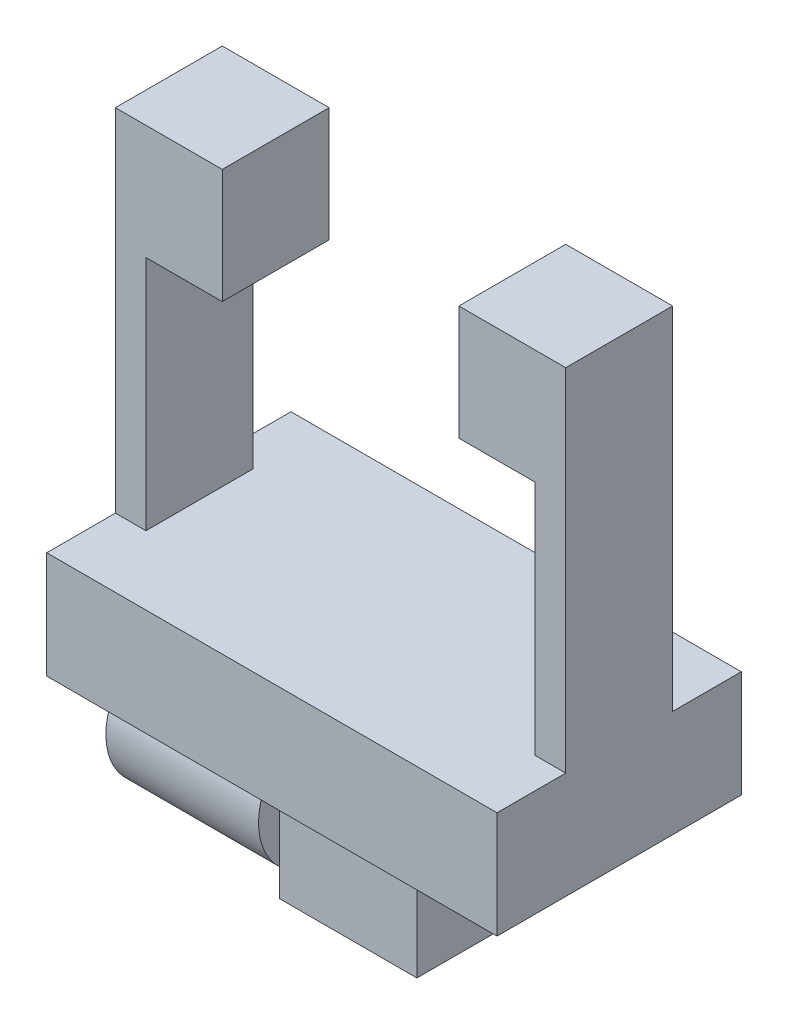
ISO-10303-21;
HEADER;
FILE_DESCRIPTION(('STEP AP214'),'2;1');
FILE_NAME('part.step','',(''),(''),'','','');
FILE_SCHEMA(('AUTOMOTIVE_DESIGN { 1 0 10303 214 1 1 1 1 }'));
ENDSEC;
DATA;
#1=APPLICATION_CONTEXT('core data for automotive mechanical design processes');
#2=APPLICATION_PROTOCOL_DEFINITION('international standard','automotive_design',2000,#1);
#3=PRODUCT_CONTEXT('',#1,'mechanical');
#4=PRODUCT('Part','Part','',(#3));
#5=PRODUCT_RELATED_PRODUCT_CATEGORY('part','',(#4));
#6=PRODUCT_DEFINITION_FORMATION('','',#4);
#7=PRODUCT_DEFINITION_CONTEXT('part definition',#1,'design');
#8=PRODUCT_DEFINITION('design','',#6,#7);
#9=PRODUCT_DEFINITION_SHAPE('','',#8);
#10=(LENGTH_UNIT() NAMED_UNIT(*) SI_UNIT(.MILLI.,.METRE.));
#11=(NAMED_UNIT(*) PLANE_ANGLE_UNIT() SI_UNIT($,.RADIAN.));
#12=(NAMED_UNIT(*) SI_UNIT($,.STERADIAN.) SOLID_ANGLE_UNIT());
#13=UNCERTAINTY_MEASURE_WITH_UNIT(LENGTH_MEASURE(1.E-05),#10,'distance_accuracy_value','');
#14=(GEOMETRIC_REPRESENTATION_CONTEXT(3) GLOBAL_UNCERTAINTY_ASSIGNED_CONTEXT((#13)) GLOBAL_UNIT_ASSIGNED_CONTEXT((#10,
#11,#12)) REPRESENTATION_CONTEXT('',''));
#15=CARTESIAN_POINT('',(0.,0.,0.));
#16=DIRECTION('',(0.,0.,1.));
#17=DIRECTION('',(1.,0.,0.));
#18=AXIS2_PLACEMENT_3D('',#15,#16,#17);
#19=CARTESIAN_POINT('',(-11.43,-8.89,7.62));
#20=DIRECTION('',(1.,0.,0.));
#21=DIRECTION('',(0.,1.,0.));
#22=AXIS2_PLACEMENT_3D('',#19,#20,#21);
#23=PLANE('',#22);
#24=CARTESIAN_POINT('',(-11.43,-21.59,0.));
#25=DIRECTION('',(-1.,0.,0.));
#26=DIRECTION('',(0.,-1.,0.));
#27=AXIS2_PLACEMENT_3D('',#24,#25,#26);
#28=CIRCLE('',#27,11.1125);
#29=CARTESIAN_POINT('',(-11.43,-13.5015356061858,7.62));
#30=VERTEX_POINT('',#29);
#31=CARTESIAN_POINT('',(-11.43,-13.5015356061858,-7.62));
#32=VERTEX_POINT('',#31);
#33=EDGE_CURVE('E66',#30,#32,#28,.T.);
#34=ORIENTED_EDGE('',*,*,#33,.F.);
#35=DIRECTION('',(0.,-1.,0.));
#36=VECTOR('',#35,1.);
#37=CARTESIAN_POINT('',(-11.43,-8.89,7.62));
#38=LINE('',#37,#36);
#39=CARTESIAN_POINT('',(-11.43,-8.89,7.62));
#40=VERTEX_POINT('',#39);
#41=EDGE_CURVE('E207',#40,#30,#38,.T.);
#42=ORIENTED_EDGE('',*,*,#41,.F.);
#43=DIRECTION('',(0.,0.,-1.));
#44=VECTOR('',#43,1.);
#45=CARTESIAN_POINT('',(-11.43,-8.89,7.62));
#46=LINE('',#45,#44);
#47=CARTESIAN_POINT('',(-11.43,-8.89,-7.62));
#48=VERTEX_POINT('',#47);
#49=EDGE_CURVE('E244',#40,#48,#46,.T.);
#50=ORIENTED_EDGE('',*,*,#49,.T.);
#51=DIRECTION('',(0.,-1.,0.));
#52=VECTOR('',#51,1.);
#53=CARTESIAN_POINT('',(-11.43,-8.89,-7.62));
#54=LINE('',#53,#52);
#55=EDGE_CURVE('E246',#48,#32,#54,.T.);
#56=ORIENTED_EDGE('',*,*,#55,.T.);
#57=EDGE_LOOP('',(#34,#42,#50,#56));
#58=FACE_BOUND('',#57,.T.);
#59=ADVANCED_FACE('F47',(#58),#23,.F.);
#60=CARTESIAN_POINT('',(37.465,-8.89,20.32));
#61=DIRECTION('',(-1.,0.,0.));
#62=DIRECTION('',(0.,0.,1.));
#63=AXIS2_PLACEMENT_3D('',#60,#61,#62);
#64=PLANE('',#63);
#65=DIRECTION('',(0.,1.,0.));
#66=VECTOR('',#65,1.);
#67=CARTESIAN_POINT('',(37.465,-8.89,-20.32));
#68=LINE('',#67,#66);
#69=CARTESIAN_POINT('',(37.465,-8.89,-20.32));
#70=VERTEX_POINT('',#69);
#71=CARTESIAN_POINT('',(37.465,8.89,-20.32));
#72=VERTEX_POINT('',#71);
#73=EDGE_CURVE('E296',#70,#72,#68,.T.);
#74=ORIENTED_EDGE('',*,*,#73,.T.);
#75=DIRECTION('',(0.,0.,-1.));
#76=VECTOR('',#75,1.);
#77=CARTESIAN_POINT('',(37.465,8.89,20.32));
#78=LINE('',#77,#76);
#79=CARTESIAN_POINT('',(37.465,8.89,-8.89));
#80=VERTEX_POINT('',#79);
#81=EDGE_CURVE('E56',#80,#72,#78,.T.);
#82=ORIENTED_EDGE('',*,*,#81,.F.);
#83=DIRECTION('',(0.,1.,0.));
#84=VECTOR('',#83,1.);
#85=CARTESIAN_POINT('',(37.465,8.89,-8.89));
#86=LINE('',#85,#84);
#87=CARTESIAN_POINT('',(37.465,67.31,-8.89));
#88=VERTEX_POINT('',#87);
#89=EDGE_CURVE('E372',#80,#88,#86,.T.);
#90=ORIENTED_EDGE('',*,*,#89,.T.);
#91=DIRECTION('',(0.,0.,-1.));
#92=VECTOR('',#91,1.);
#93=CARTESIAN_POINT('',(37.465,67.31,8.89));
#94=LINE('',#93,#92);
#95=CARTESIAN_POINT('',(37.465,67.31,8.89));
#96=VERTEX_POINT('',#95);
#97=EDGE_CURVE('E389',#96,#88,#94,.T.);
#98=ORIENTED_EDGE('',*,*,#97,.F.);
#99=DIRECTION('',(0.,1.,0.));
#100=VECTOR('',#99,1.);
#101=CARTESIAN_POINT('',(37.465,8.89,8.89));
#102=LINE('',#101,#100);
#103=CARTESIAN_POINT('',(37.465,8.89,8.89));
#104=VERTEX_POINT('',#103);
#105=EDGE_CURVE('E290',#104,#96,#102,.T.);
#106=ORIENTED_EDGE('',*,*,#105,.F.);
#107=CARTESIAN_POINT('',(37.465,8.89,20.32));
#108=VERTEX_POINT('',#107);
#109=EDGE_CURVE('E12',#108,#104,#78,.T.);
#110=ORIENTED_EDGE('',*,*,#109,.F.);
#111=DIRECTION('',(0.,1.,0.));
#112=VECTOR('',#111,1.);
#113=CARTESIAN_POINT('',(37.465,-8.89,20.32));
#114=LINE('',#113,#112);
#115=CARTESIAN_POINT('',(37.465,-8.89,20.32));
#116=VERTEX_POINT('',#115);
#117=EDGE_CURVE('E279',#116,#108,#114,.T.);
#118=ORIENTED_EDGE('',*,*,#117,.F.);
#119=DIRECTION('',(0.,0.,-1.));
#120=VECTOR('',#119,1.);
#121=CARTESIAN_POINT('',(37.465,-8.89,20.32));
#122=LINE('',#121,#120);
#123=EDGE_CURVE('E300',#116,#70,#122,.T.);
#124=ORIENTED_EDGE('',*,*,#123,.T.);
#125=EDGE_LOOP('',(#74,#82,#90,#98,#106,#110,#118,#124));
#126=FACE_BOUND('',#125,.T.);
#127=ADVANCED_FACE('F51',(#126),#64,.F.);
#128=CARTESIAN_POINT('',(-37.465,8.89,20.32));
#129=DIRECTION('',(0.,-1.,0.));
#130=DIRECTION('',(0.,0.,-1.));
#131=AXIS2_PLACEMENT_3D('',#128,#129,#130);
#132=PLANE('',#131);
#133=DIRECTION('',(0.,0.,-1.));
#134=VECTOR('',#133,1.);
#135=CARTESIAN_POINT('',(-37.465,8.89,20.32));
#136=LINE('',#135,#134);
#137=CARTESIAN_POINT('',(-37.465,8.89,-8.89));
#138=VERTEX_POINT('',#137);
#139=CARTESIAN_POINT('',(-37.465,8.89,-20.32));
#140=VERTEX_POINT('',#139);
#141=EDGE_CURVE('E319',#138,#140,#136,.T.);
#142=ORIENTED_EDGE('',*,*,#141,.F.);
#143=DIRECTION('',(1.,0.,0.));
#144=VECTOR('',#143,1.);
#145=CARTESIAN_POINT('',(-37.465,8.89,-8.89));
#146=LINE('',#145,#144);
#147=CARTESIAN_POINT('',(-32.385,8.89,-8.89));
#148=VERTEX_POINT('',#147);
#149=EDGE_CURVE('E373',#138,#148,#146,.T.);
#150=ORIENTED_EDGE('',*,*,#149,.T.);
#151=DIRECTION('',(0.,0.,-1.));
#152=VECTOR('',#151,1.);
#153=CARTESIAN_POINT('',(-32.385,8.89,8.89));
#154=LINE('',#153,#152);
#155=CARTESIAN_POINT('',(-32.385,8.89,8.89));
#156=VERTEX_POINT('',#155);
#157=EDGE_CURVE('E303',#156,#148,#154,.T.);
#158=ORIENTED_EDGE('',*,*,#157,.F.);
#159=DIRECTION('',(1.,0.,0.));
#160=VECTOR('',#159,1.);
#161=CARTESIAN_POINT('',(-37.465,8.89,8.89));
#162=LINE('',#161,#160);
#163=CARTESIAN_POINT('',(-37.465,8.89,8.89));
#164=VERTEX_POINT('',#163);
#165=EDGE_CURVE('E354',#164,#156,#162,.T.);
#166=ORIENTED_EDGE('',*,*,#165,.F.);
#167=CARTESIAN_POINT('',(-37.465,8.89,20.32));
#168=VERTEX_POINT('',#167);
#169=EDGE_CURVE('E316',#168,#164,#136,.T.);
#170=ORIENTED_EDGE('',*,*,#169,.F.);
#171=DIRECTION('',(-1.,0.,0.));
#172=VECTOR('',#171,1.);
#173=CARTESIAN_POINT('',(-37.465,8.89,20.32));
#174=LINE('',#173,#172);
#175=EDGE_CURVE('E284',#108,#168,#174,.T.);
#176=ORIENTED_EDGE('',*,*,#175,.F.);
#177=ORIENTED_EDGE('',*,*,#109,.T.);
#178=DIRECTION('',(1.,0.,0.));
#179=VECTOR('',#178,1.);
#180=CARTESIAN_POINT('',(37.465,8.89,8.89));
#181=LINE('',#180,#179);
#182=CARTESIAN_POINT('',(32.385,8.89,8.89));
#183=VERTEX_POINT('',#182);
#184=EDGE_CURVE('E392',#183,#104,#181,.T.);
#185=ORIENTED_EDGE('',*,*,#184,.F.);
#186=DIRECTION('',(0.,0.,-1.));
#187=VECTOR('',#186,1.);
#188=CARTESIAN_POINT('',(32.385,8.89,8.89));
#189=LINE('',#188,#187);
#190=CARTESIAN_POINT('',(32.385,8.89,-8.89));
#191=VERTEX_POINT('',#190);
#192=EDGE_CURVE('E386',#183,#191,#189,.T.);
#193=ORIENTED_EDGE('',*,*,#192,.T.);
#194=DIRECTION('',(1.,0.,0.));
#195=VECTOR('',#194,1.);
#196=CARTESIAN_POINT('',(37.465,8.89,-8.89));
#197=LINE('',#196,#195);
#198=EDGE_CURVE('E393',#191,#80,#197,.T.);
#199=ORIENTED_EDGE('',*,*,#198,.T.);
#200=ORIENTED_EDGE('',*,*,#81,.T.);
#201=DIRECTION('',(-1.,0.,0.));
#202=VECTOR('',#201,1.);
#203=CARTESIAN_POINT('',(-37.465,8.89,-20.32));
#204=LINE('',#203,#202);
#205=EDGE_CURVE('E305',#72,#140,#204,.T.);
#206=ORIENTED_EDGE('',*,*,#205,.T.);
#207=EDGE_LOOP('',(#142,#150,#158,#166,#170,#176,#177,#185,#193,#199,#200,#206));
#208=FACE_BOUND('',#207,.T.);
#209=ADVANCED_FACE('F340',(#208),#132,.F.);
#210=CARTESIAN_POINT('',(-37.465,-8.89,20.32));
#211=DIRECTION('',(1.,0.,0.));
#212=DIRECTION('',(0.,0.,-1.));
#213=AXIS2_PLACEMENT_3D('',#210,#211,#212);
#214=PLANE('',#213);
#215=DIRECTION('',(0.,-1.,0.));
#216=VECTOR('',#215,1.);
#217=CARTESIAN_POINT('',(-37.465,-8.89,-20.32));
#218=LINE('',#217,#216);
#219=CARTESIAN_POINT('',(-37.465,-8.89,-20.32));
#220=VERTEX_POINT('',#219);
#221=EDGE_CURVE('E310',#140,#220,#218,.T.);
#222=ORIENTED_EDGE('',*,*,#221,.T.);
#223=DIRECTION('',(0.,0.,-1.));
#224=VECTOR('',#223,1.);
#225=CARTESIAN_POINT('',(-37.465,-8.89,20.32));
#226=LINE('',#225,#224);
#227=CARTESIAN_POINT('',(-37.465,-8.89,20.32));
#228=VERTEX_POINT('',#227);
#229=EDGE_CURVE('E314',#228,#220,#226,.T.);
#230=ORIENTED_EDGE('',*,*,#229,.F.);
#231=DIRECTION('',(0.,-1.,0.));
#232=VECTOR('',#231,1.);
#233=CARTESIAN_POINT('',(-37.465,-8.89,20.32));
#234=LINE('',#233,#232);
#235=EDGE_CURVE('E293',#168,#228,#234,.T.);
#236=ORIENTED_EDGE('',*,*,#235,.F.);
#237=ORIENTED_EDGE('',*,*,#169,.T.);
#238=DIRECTION('',(0.,-1.,0.));
#239=VECTOR('',#238,1.);
#240=CARTESIAN_POINT('',(-37.465,8.89,8.89));
#241=LINE('',#240,#239);
#242=CARTESIAN_POINT('',(-37.465,67.31,8.89));
#243=VERTEX_POINT('',#242);
#244=EDGE_CURVE('E363',#243,#164,#241,.T.);
#245=ORIENTED_EDGE('',*,*,#244,.F.);
#246=DIRECTION('',(0.,0.,-1.));
#247=VECTOR('',#246,1.);
#248=CARTESIAN_POINT('',(-37.465,67.31,8.89));
#249=LINE('',#248,#247);
#250=CARTESIAN_POINT('',(-37.465,67.31,-8.89));
#251=VERTEX_POINT('',#250);
#252=EDGE_CURVE('E439',#243,#251,#249,.T.);
#253=ORIENTED_EDGE('',*,*,#252,.T.);
#254=DIRECTION('',(0.,-1.,0.));
#255=VECTOR('',#254,1.);
#256=CARTESIAN_POINT('',(-37.465,8.89,-8.89));
#257=LINE('',#256,#255);
#258=EDGE_CURVE('E332',#251,#138,#257,.T.);
#259=ORIENTED_EDGE('',*,*,#258,.T.);
#260=ORIENTED_EDGE('',*,*,#141,.T.);
#261=EDGE_LOOP('',(#222,#230,#236,#237,#245,#253,#259,#260));
#262=FACE_BOUND('',#261,.T.);
#263=ADVANCED_FACE('F328',(#262),#214,.F.);
#264=CARTESIAN_POINT('',(-37.465,-8.89,20.32));
#265=DIRECTION('',(0.,1.,0.));
#266=DIRECTION('',(0.,0.,1.));
#267=AXIS2_PLACEMENT_3D('',#264,#265,#266);
#268=PLANE('',#267);
#269=DIRECTION('',(0.,0.,-1.));
#270=VECTOR('',#269,1.);
#271=CARTESIAN_POINT('',(11.43,-8.89,7.62));
#272=LINE('',#271,#270);
#273=CARTESIAN_POINT('',(11.43,-8.89,7.62));
#274=VERTEX_POINT('',#273);
#275=CARTESIAN_POINT('',(11.43,-8.89,-7.62));
#276=VERTEX_POINT('',#275);
#277=EDGE_CURVE('E265',#274,#276,#272,.T.);
#278=ORIENTED_EDGE('',*,*,#277,.T.);
#279=DIRECTION('',(-1.,0.,0.));
#280=VECTOR('',#279,1.);
#281=CARTESIAN_POINT('',(-11.43,-8.89,-7.62));
#282=LINE('',#281,#280);
#283=EDGE_CURVE('E218',#276,#48,#282,.T.);
#284=ORIENTED_EDGE('',*,*,#283,.T.);
#285=ORIENTED_EDGE('',*,*,#49,.F.);
#286=DIRECTION('',(-1.,0.,0.));
#287=VECTOR('',#286,1.);
#288=CARTESIAN_POINT('',(-11.43,-8.89,7.62));
#289=LINE('',#288,#287);
#290=EDGE_CURVE('E245',#274,#40,#289,.T.);
#291=ORIENTED_EDGE('',*,*,#290,.F.);
#292=EDGE_LOOP('',(#278,#284,#285,#291));
#293=FACE_BOUND('',#292,.T.);
#294=DIRECTION('',(1.,0.,0.));
#295=VECTOR('',#294,1.);
#296=CARTESIAN_POINT('',(-37.465,-8.89,-20.32));
#297=LINE('',#296,#295);
#298=EDGE_CURVE('E286',#220,#70,#297,.T.);
#299=ORIENTED_EDGE('',*,*,#298,.T.);
#300=ORIENTED_EDGE('',*,*,#123,.F.);
#301=DIRECTION('',(1.,0.,0.));
#302=VECTOR('',#301,1.);
#303=CARTESIAN_POINT('',(-37.465,-8.89,20.32));
#304=LINE('',#303,#302);
#305=EDGE_CURVE('E295',#228,#116,#304,.T.);
#306=ORIENTED_EDGE('',*,*,#305,.F.);
#307=ORIENTED_EDGE('',*,*,#229,.T.);
#308=EDGE_LOOP('',(#299,#300,#306,#307));
#309=FACE_BOUND('',#308,.T.);
#310=ADVANCED_FACE('F346',(#293,#309),#268,.F.);
#311=CARTESIAN_POINT('',(0.,0.,20.32));
#312=DIRECTION('',(0.,0.,-1.));
#313=DIRECTION('',(-1.,0.,0.));
#314=AXIS2_PLACEMENT_3D('',#311,#312,#313);
#315=PLANE('',#314);
#316=ORIENTED_EDGE('',*,*,#117,.T.);
#317=ORIENTED_EDGE('',*,*,#175,.T.);
#318=ORIENTED_EDGE('',*,*,#235,.T.);
#319=ORIENTED_EDGE('',*,*,#305,.T.);
#320=EDGE_LOOP('',(#316,#317,#318,#319));
#321=FACE_BOUND('',#320,.T.);
#322=ADVANCED_FACE('F352',(#321),#315,.F.);
#323=CARTESIAN_POINT('',(0.,0.,-20.32));
#324=DIRECTION('',(0.,0.,-1.));
#325=DIRECTION('',(-1.,0.,0.));
#326=AXIS2_PLACEMENT_3D('',#323,#324,#325);
#327=PLANE('',#326);
#328=ORIENTED_EDGE('',*,*,#73,.F.);
#329=ORIENTED_EDGE('',*,*,#298,.F.);
#330=ORIENTED_EDGE('',*,*,#221,.F.);
#331=ORIENTED_EDGE('',*,*,#205,.F.);
#332=EDGE_LOOP('',(#328,#329,#330,#331));
#333=FACE_BOUND('',#332,.T.);
#334=ADVANCED_FACE('F341',(#333),#327,.T.);
#335=CARTESIAN_POINT('',(32.385,8.89,8.89));
#336=DIRECTION('',(1.,0.,0.));
#337=DIRECTION('',(0.,0.,-1.));
#338=AXIS2_PLACEMENT_3D('',#335,#336,#337);
#339=PLANE('',#338);
#340=DIRECTION('',(0.,-1.,0.));
#341=VECTOR('',#340,1.);
#342=CARTESIAN_POINT('',(32.385,8.89,-8.89));
#343=LINE('',#342,#341);
#344=CARTESIAN_POINT('',(32.385,48.26,-8.89));
#345=VERTEX_POINT('',#344);
#346=EDGE_CURVE('E400',#345,#191,#343,.T.);
#347=ORIENTED_EDGE('',*,*,#346,.T.);
#348=ORIENTED_EDGE('',*,*,#192,.F.);
#349=DIRECTION('',(0.,-1.,0.));
#350=VECTOR('',#349,1.);
#351=CARTESIAN_POINT('',(32.385,8.89,8.89));
#352=LINE('',#351,#350);
#353=CARTESIAN_POINT('',(32.385,48.26,8.89));
#354=VERTEX_POINT('',#353);
#355=EDGE_CURVE('E404',#354,#183,#352,.T.);
#356=ORIENTED_EDGE('',*,*,#355,.F.);
#357=DIRECTION('',(0.,0.,-1.));
#358=VECTOR('',#357,1.);
#359=CARTESIAN_POINT('',(32.385,48.26,8.89));
#360=LINE('',#359,#358);
#361=EDGE_CURVE('E381',#354,#345,#360,.T.);
#362=ORIENTED_EDGE('',*,*,#361,.T.);
#363=EDGE_LOOP('',(#347,#348,#356,#362));
#364=FACE_BOUND('',#363,.T.);
#365=ADVANCED_FACE('F686',(#364),#339,.F.);
#366=CARTESIAN_POINT('',(0.,0.,8.89));
#367=DIRECTION('',(0.,0.,1.));
#368=DIRECTION('',(1.,0.,0.));
#369=AXIS2_PLACEMENT_3D('',#366,#367,#368);
#370=PLANE('',#369);
#371=ORIENTED_EDGE('',*,*,#105,.T.);
#372=DIRECTION('',(-1.,0.,0.));
#373=VECTOR('',#372,1.);
#374=CARTESIAN_POINT('',(37.465,67.31,8.89));
#375=LINE('',#374,#373);
#376=CARTESIAN_POINT('',(19.685,67.31,8.89));
#377=VERTEX_POINT('',#376);
#378=EDGE_CURVE('E274',#96,#377,#375,.T.);
#379=ORIENTED_EDGE('',*,*,#378,.T.);
#380=DIRECTION('',(0.,-1.,0.));
#381=VECTOR('',#380,1.);
#382=CARTESIAN_POINT('',(19.685,48.26,8.89));
#383=LINE('',#382,#381);
#384=CARTESIAN_POINT('',(19.685,48.26,8.89));
#385=VERTEX_POINT('',#384);
#386=EDGE_CURVE('E421',#377,#385,#383,.T.);
#387=ORIENTED_EDGE('',*,*,#386,.T.);
#388=DIRECTION('',(1.,0.,0.));
#389=VECTOR('',#388,1.);
#390=CARTESIAN_POINT('',(37.465,48.26,8.89));
#391=LINE('',#390,#389);
#392=EDGE_CURVE('E769',#385,#354,#391,.T.);
#393=ORIENTED_EDGE('',*,*,#392,.T.);
#394=ORIENTED_EDGE('',*,*,#355,.T.);
#395=ORIENTED_EDGE('',*,*,#184,.T.);
#396=EDGE_LOOP('',(#371,#379,#387,#393,#394,#395));
#397=FACE_BOUND('',#396,.T.);
#398=ADVANCED_FACE('F415',(#397),#370,.T.);
#399=CARTESIAN_POINT('',(0.,0.,-8.89));
#400=DIRECTION('',(0.,0.,1.));
#401=DIRECTION('',(1.,0.,0.));
#402=AXIS2_PLACEMENT_3D('',#399,#400,#401);
#403=PLANE('',#402);
#404=ORIENTED_EDGE('',*,*,#89,.F.);
#405=ORIENTED_EDGE('',*,*,#198,.F.);
#406=ORIENTED_EDGE('',*,*,#346,.F.);
#407=DIRECTION('',(1.,0.,0.));
#408=VECTOR('',#407,1.);
#409=CARTESIAN_POINT('',(37.465,48.26,-8.89));
#410=LINE('',#409,#408);
#411=CARTESIAN_POINT('',(19.685,48.26,-8.89));
#412=VERTEX_POINT('',#411);
#413=EDGE_CURVE('E425',#412,#345,#410,.T.);
#414=ORIENTED_EDGE('',*,*,#413,.F.);
#415=DIRECTION('',(0.,-1.,0.));
#416=VECTOR('',#415,1.);
#417=CARTESIAN_POINT('',(19.685,48.26,-8.89));
#418=LINE('',#417,#416);
#419=CARTESIAN_POINT('',(19.685,67.31,-8.89));
#420=VERTEX_POINT('',#419);
#421=EDGE_CURVE('E762',#420,#412,#418,.T.);
#422=ORIENTED_EDGE('',*,*,#421,.F.);
#423=DIRECTION('',(-1.,0.,0.));
#424=VECTOR('',#423,1.);
#425=CARTESIAN_POINT('',(37.465,67.31,-8.89));
#426=LINE('',#425,#424);
#427=EDGE_CURVE('E452',#88,#420,#426,.T.);
#428=ORIENTED_EDGE('',*,*,#427,.F.);
#429=EDGE_LOOP('',(#404,#405,#406,#414,#422,#428));
#430=FACE_BOUND('',#429,.T.);
#431=ADVANCED_FACE('F484',(#430),#403,.F.);
#432=CARTESIAN_POINT('',(-32.385,8.89,8.89));
#433=DIRECTION('',(-1.,0.,0.));
#434=DIRECTION('',(0.,0.,1.));
#435=AXIS2_PLACEMENT_3D('',#432,#433,#434);
#436=PLANE('',#435);
#437=DIRECTION('',(0.,1.,0.));
#438=VECTOR('',#437,1.);
#439=CARTESIAN_POINT('',(-32.385,8.89,-8.89));
#440=LINE('',#439,#438);
#441=CARTESIAN_POINT('',(-32.385,48.26,-8.89));
#442=VERTEX_POINT('',#441);
#443=EDGE_CURVE('E370',#148,#442,#440,.T.);
#444=ORIENTED_EDGE('',*,*,#443,.T.);
#445=DIRECTION('',(0.,0.,-1.));
#446=VECTOR('',#445,1.);
#447=CARTESIAN_POINT('',(-32.385,48.26,8.89));
#448=LINE('',#447,#446);
#449=CARTESIAN_POINT('',(-32.385,48.26,8.89));
#450=VERTEX_POINT('',#449);
#451=EDGE_CURVE('E362',#450,#442,#448,.T.);
#452=ORIENTED_EDGE('',*,*,#451,.F.);
#453=DIRECTION('',(0.,1.,0.));
#454=VECTOR('',#453,1.);
#455=CARTESIAN_POINT('',(-32.385,8.89,8.89));
#456=LINE('',#455,#454);
#457=EDGE_CURVE('E359',#156,#450,#456,.T.);
#458=ORIENTED_EDGE('',*,*,#457,.F.);
#459=ORIENTED_EDGE('',*,*,#157,.T.);
#460=EDGE_LOOP('',(#444,#452,#458,#459));
#461=FACE_BOUND('',#460,.T.);
#462=ADVANCED_FACE('F482',(#461),#436,.F.);
#463=CARTESIAN_POINT('',(0.,0.,8.89));
#464=DIRECTION('',(0.,0.,-1.));
#465=DIRECTION('',(-1.,0.,0.));
#466=AXIS2_PLACEMENT_3D('',#463,#464,#465);
#467=PLANE('',#466);
#468=ORIENTED_EDGE('',*,*,#244,.T.);
#469=ORIENTED_EDGE('',*,*,#165,.T.);
#470=ORIENTED_EDGE('',*,*,#457,.T.);
#471=DIRECTION('',(1.,0.,0.));
#472=VECTOR('',#471,1.);
#473=CARTESIAN_POINT('',(-37.465,48.26,8.89));
#474=LINE('',#473,#472);
#475=CARTESIAN_POINT('',(-19.685,48.26,8.89));
#476=VERTEX_POINT('',#475);
#477=EDGE_CURVE('E446',#450,#476,#474,.T.);
#478=ORIENTED_EDGE('',*,*,#477,.T.);
#479=DIRECTION('',(0.,1.,0.));
#480=VECTOR('',#479,1.);
#481=CARTESIAN_POINT('',(-19.685,48.26,8.89));
#482=LINE('',#481,#480);
#483=CARTESIAN_POINT('',(-19.685,67.31,8.89));
#484=VERTEX_POINT('',#483);
#485=EDGE_CURVE('E458',#476,#484,#482,.T.);
#486=ORIENTED_EDGE('',*,*,#485,.T.);
#487=DIRECTION('',(-1.,0.,0.));
#488=VECTOR('',#487,1.);
#489=CARTESIAN_POINT('',(-37.465,67.31,8.89));
#490=LINE('',#489,#488);
#491=EDGE_CURVE('E442',#484,#243,#490,.T.);
#492=ORIENTED_EDGE('',*,*,#491,.T.);
#493=EDGE_LOOP('',(#468,#469,#470,#478,#486,#492));
#494=FACE_BOUND('',#493,.T.);
#495=ADVANCED_FACE('F463',(#494),#467,.F.);
#496=CARTESIAN_POINT('',(0.,0.,-8.89));
#497=DIRECTION('',(0.,0.,-1.));
#498=DIRECTION('',(-1.,0.,0.));
#499=AXIS2_PLACEMENT_3D('',#496,#497,#498);
#500=PLANE('',#499);
#501=ORIENTED_EDGE('',*,*,#258,.F.);
#502=DIRECTION('',(-1.,0.,0.));
#503=VECTOR('',#502,1.);
#504=CARTESIAN_POINT('',(-37.465,67.31,-8.89));
#505=LINE('',#504,#503);
#506=CARTESIAN_POINT('',(-19.685,67.31,-8.89));
#507=VERTEX_POINT('',#506);
#508=EDGE_CURVE('E443',#507,#251,#505,.T.);
#509=ORIENTED_EDGE('',*,*,#508,.F.);
#510=DIRECTION('',(0.,1.,0.));
#511=VECTOR('',#510,1.);
#512=CARTESIAN_POINT('',(-19.685,48.26,-8.89));
#513=LINE('',#512,#511);
#514=CARTESIAN_POINT('',(-19.685,48.26,-8.89));
#515=VERTEX_POINT('',#514);
#516=EDGE_CURVE('E449',#515,#507,#513,.T.);
#517=ORIENTED_EDGE('',*,*,#516,.F.);
#518=DIRECTION('',(1.,0.,0.));
#519=VECTOR('',#518,1.);
#520=CARTESIAN_POINT('',(-37.465,48.26,-8.89));
#521=LINE('',#520,#519);
#522=EDGE_CURVE('E455',#442,#515,#521,.T.);
#523=ORIENTED_EDGE('',*,*,#522,.F.);
#524=ORIENTED_EDGE('',*,*,#443,.F.);
#525=ORIENTED_EDGE('',*,*,#149,.F.);
#526=EDGE_LOOP('',(#501,#509,#517,#523,#524,#525));
#527=FACE_BOUND('',#526,.T.);
#528=ADVANCED_FACE('F479',(#527),#500,.T.);
#529=CARTESIAN_POINT('',(-37.465,48.26,8.89));
#530=DIRECTION('',(0.,1.,0.));
#531=DIRECTION('',(0.,0.,1.));
#532=AXIS2_PLACEMENT_3D('',#529,#530,#531);
#533=PLANE('',#532);
#534=ORIENTED_EDGE('',*,*,#477,.F.);
#535=ORIENTED_EDGE('',*,*,#451,.T.);
#536=ORIENTED_EDGE('',*,*,#522,.T.);
#537=DIRECTION('',(0.,0.,-1.));
#538=VECTOR('',#537,1.);
#539=CARTESIAN_POINT('',(-19.685,48.26,8.89));
#540=LINE('',#539,#538);
#541=EDGE_CURVE('E271',#476,#515,#540,.T.);
#542=ORIENTED_EDGE('',*,*,#541,.F.);
#543=EDGE_LOOP('',(#534,#535,#536,#542));
#544=FACE_BOUND('',#543,.T.);
#545=ADVANCED_FACE('F469',(#544),#533,.F.);
#546=CARTESIAN_POINT('',(-19.685,48.26,8.89));
#547=DIRECTION('',(-1.,0.,0.));
#548=DIRECTION('',(0.,0.,1.));
#549=AXIS2_PLACEMENT_3D('',#546,#547,#548);
#550=PLANE('',#549);
#551=ORIENTED_EDGE('',*,*,#516,.T.);
#552=DIRECTION('',(0.,0.,-1.));
#553=VECTOR('',#552,1.);
#554=CARTESIAN_POINT('',(-19.685,67.31,8.89));
#555=LINE('',#554,#553);
#556=EDGE_CURVE('E436',#484,#507,#555,.T.);
#557=ORIENTED_EDGE('',*,*,#556,.F.);
#558=ORIENTED_EDGE('',*,*,#485,.F.);
#559=ORIENTED_EDGE('',*,*,#541,.T.);
#560=EDGE_LOOP('',(#551,#557,#558,#559));
#561=FACE_BOUND('',#560,.T.);
#562=ADVANCED_FACE('F471',(#561),#550,.F.);
#563=CARTESIAN_POINT('',(-37.465,67.31,8.89));
#564=DIRECTION('',(0.,-1.,0.));
#565=DIRECTION('',(0.,0.,-1.));
#566=AXIS2_PLACEMENT_3D('',#563,#564,#565);
#567=PLANE('',#566);
#568=ORIENTED_EDGE('',*,*,#508,.T.);
#569=ORIENTED_EDGE('',*,*,#252,.F.);
#570=ORIENTED_EDGE('',*,*,#491,.F.);
#571=ORIENTED_EDGE('',*,*,#556,.T.);
#572=EDGE_LOOP('',(#568,#569,#570,#571));
#573=FACE_BOUND('',#572,.T.);
#574=ADVANCED_FACE('F477',(#573),#567,.F.);
#575=CARTESIAN_POINT('',(37.465,67.31,8.89));
#576=DIRECTION('',(0.,-1.,0.));
#577=DIRECTION('',(0.,0.,-1.));
#578=AXIS2_PLACEMENT_3D('',#575,#576,#577);
#579=PLANE('',#578);
#580=ORIENTED_EDGE('',*,*,#427,.T.);
#581=DIRECTION('',(0.,0.,-1.));
#582=VECTOR('',#581,1.);
#583=CARTESIAN_POINT('',(19.685,67.31,8.89));
#584=LINE('',#583,#582);
#585=EDGE_CURVE('E419',#377,#420,#584,.T.);
#586=ORIENTED_EDGE('',*,*,#585,.F.);
#587=ORIENTED_EDGE('',*,*,#378,.F.);
#588=ORIENTED_EDGE('',*,*,#97,.T.);
#589=EDGE_LOOP('',(#580,#586,#587,#588));
#590=FACE_BOUND('',#589,.T.);
#591=ADVANCED_FACE('F417',(#590),#579,.F.);
#592=CARTESIAN_POINT('',(19.685,48.26,8.89));
#593=DIRECTION('',(1.,0.,0.));
#594=DIRECTION('',(0.,0.,-1.));
#595=AXIS2_PLACEMENT_3D('',#592,#593,#594);
#596=PLANE('',#595);
#597=ORIENTED_EDGE('',*,*,#421,.T.);
#598=DIRECTION('',(0.,0.,-1.));
#599=VECTOR('',#598,1.);
#600=CARTESIAN_POINT('',(19.685,48.26,8.89));
#601=LINE('',#600,#599);
#602=EDGE_CURVE('E429',#385,#412,#601,.T.);
#603=ORIENTED_EDGE('',*,*,#602,.F.);
#604=ORIENTED_EDGE('',*,*,#386,.F.);
#605=ORIENTED_EDGE('',*,*,#585,.T.);
#606=EDGE_LOOP('',(#597,#603,#604,#605));
#607=FACE_BOUND('',#606,.T.);
#608=ADVANCED_FACE('F511',(#607),#596,.F.);
#609=CARTESIAN_POINT('',(37.465,48.26,8.89));
#610=DIRECTION('',(0.,1.,0.));
#611=DIRECTION('',(0.,0.,1.));
#612=AXIS2_PLACEMENT_3D('',#609,#610,#611);
#613=PLANE('',#612);
#614=ORIENTED_EDGE('',*,*,#361,.F.);
#615=ORIENTED_EDGE('',*,*,#392,.F.);
#616=ORIENTED_EDGE('',*,*,#602,.T.);
#617=ORIENTED_EDGE('',*,*,#413,.T.);
#618=EDGE_LOOP('',(#614,#615,#616,#617));
#619=FACE_BOUND('',#618,.T.);
#620=ADVANCED_FACE('F506',(#619),#613,.F.);
#621=CARTESIAN_POINT('',(-11.43,-29.6784643938142,-7.62));
#622=VERTEX_POINT('',#621);
#623=CARTESIAN_POINT('',(-11.43,-29.6784643938142,7.62));
#624=VERTEX_POINT('',#623);
#625=EDGE_CURVE('E73',#622,#624,#28,.T.);
#626=ORIENTED_EDGE('',*,*,#625,.F.);
#627=CARTESIAN_POINT('',(-11.43,-34.29,-7.62));
#628=VERTEX_POINT('',#627);
#629=EDGE_CURVE('E213',#622,#628,#54,.T.);
#630=ORIENTED_EDGE('',*,*,#629,.T.);
#631=DIRECTION('',(0.,0.,-1.));
#632=VECTOR('',#631,1.);
#633=CARTESIAN_POINT('',(-11.43,-34.29,7.62));
#634=LINE('',#633,#632);
#635=CARTESIAN_POINT('',(-11.43,-34.29,7.62));
#636=VERTEX_POINT('',#635);
#637=EDGE_CURVE('E220',#636,#628,#634,.T.);
#638=ORIENTED_EDGE('',*,*,#637,.F.);
#639=EDGE_CURVE('E203',#624,#636,#38,.T.);
#640=ORIENTED_EDGE('',*,*,#639,.F.);
#641=EDGE_LOOP('',(#626,#630,#638,#640));
#642=FACE_BOUND('',#641,.T.);
#643=ADVANCED_FACE('F212',(#642),#23,.F.);
#644=CARTESIAN_POINT('',(-11.43,-34.29,7.62));
#645=DIRECTION('',(0.,1.,0.));
#646=DIRECTION('',(0.,0.,1.));
#647=AXIS2_PLACEMENT_3D('',#644,#645,#646);
#648=PLANE('',#647);
#649=DIRECTION('',(1.,0.,0.));
#650=VECTOR('',#649,1.);
#651=CARTESIAN_POINT('',(-11.43,-34.29,-7.62));
#652=LINE('',#651,#650);
#653=CARTESIAN_POINT('',(11.43,-34.29,-7.62));
#654=VERTEX_POINT('',#653);
#655=EDGE_CURVE('E248',#628,#654,#652,.T.);
#656=ORIENTED_EDGE('',*,*,#655,.T.);
#657=DIRECTION('',(0.,0.,-1.));
#658=VECTOR('',#657,1.);
#659=CARTESIAN_POINT('',(11.43,-34.29,7.62));
#660=LINE('',#659,#658);
#661=CARTESIAN_POINT('',(11.43,-34.29,7.62));
#662=VERTEX_POINT('',#661);
#663=EDGE_CURVE('E266',#662,#654,#660,.T.);
#664=ORIENTED_EDGE('',*,*,#663,.F.);
#665=DIRECTION('',(1.,0.,0.));
#666=VECTOR('',#665,1.);
#667=CARTESIAN_POINT('',(-11.43,-34.29,7.62));
#668=LINE('',#667,#666);
#669=EDGE_CURVE('E236',#636,#662,#668,.T.);
#670=ORIENTED_EDGE('',*,*,#669,.F.);
#671=ORIENTED_EDGE('',*,*,#637,.T.);
#672=EDGE_LOOP('',(#656,#664,#670,#671));
#673=FACE_BOUND('',#672,.T.);
#674=ADVANCED_FACE('F504',(#673),#648,.F.);
#675=CARTESIAN_POINT('',(11.43,-8.89,7.62));
#676=DIRECTION('',(-1.,0.,0.));
#677=DIRECTION('',(0.,-1.,0.));
#678=AXIS2_PLACEMENT_3D('',#675,#676,#677);
#679=PLANE('',#678);
#680=DIRECTION('',(0.,1.,0.));
#681=VECTOR('',#680,1.);
#682=CARTESIAN_POINT('',(11.43,-8.89,-7.62));
#683=LINE('',#682,#681);
#684=EDGE_CURVE('E254',#654,#276,#683,.T.);
#685=ORIENTED_EDGE('',*,*,#684,.T.);
#686=ORIENTED_EDGE('',*,*,#277,.F.);
#687=DIRECTION('',(0.,1.,0.));
#688=VECTOR('',#687,1.);
#689=CARTESIAN_POINT('',(11.43,-8.89,7.62));
#690=LINE('',#689,#688);
#691=EDGE_CURVE('E237',#662,#274,#690,.T.);
#692=ORIENTED_EDGE('',*,*,#691,.F.);
#693=ORIENTED_EDGE('',*,*,#663,.T.);
#694=EDGE_LOOP('',(#685,#686,#692,#693));
#695=FACE_BOUND('',#694,.T.);
#696=ADVANCED_FACE('F512',(#695),#679,.F.);
#697=CARTESIAN_POINT('',(0.,0.,7.62));
#698=DIRECTION('',(0.,0.,1.));
#699=DIRECTION('',(1.,0.,0.));
#700=AXIS2_PLACEMENT_3D('',#697,#698,#699);
#701=PLANE('',#700);
#702=ORIENTED_EDGE('',*,*,#41,.T.);
#703=EDGE_CURVE('E205',#30,#624,#38,.T.);
#704=ORIENTED_EDGE('',*,*,#703,.T.);
#705=ORIENTED_EDGE('',*,*,#639,.T.);
#706=ORIENTED_EDGE('',*,*,#669,.T.);
#707=ORIENTED_EDGE('',*,*,#691,.T.);
#708=ORIENTED_EDGE('',*,*,#290,.T.);
#709=EDGE_LOOP('',(#702,#704,#705,#706,#707,#708));
#710=FACE_BOUND('',#709,.T.);
#711=ADVANCED_FACE('F202',(#710),#701,.T.);
#712=CARTESIAN_POINT('',(0.,0.,-7.62));
#713=DIRECTION('',(0.,0.,1.));
#714=DIRECTION('',(1.,0.,0.));
#715=AXIS2_PLACEMENT_3D('',#712,#713,#714);
#716=PLANE('',#715);
#717=ORIENTED_EDGE('',*,*,#55,.F.);
#718=ORIENTED_EDGE('',*,*,#283,.F.);
#719=ORIENTED_EDGE('',*,*,#684,.F.);
#720=ORIENTED_EDGE('',*,*,#655,.F.);
#721=ORIENTED_EDGE('',*,*,#629,.F.);
#722=EDGE_CURVE('E249',#32,#622,#54,.T.);
#723=ORIENTED_EDGE('',*,*,#722,.F.);
#724=EDGE_LOOP('',(#717,#718,#719,#720,#721,#723));
#725=FACE_BOUND('',#724,.T.);
#726=ADVANCED_FACE('F591',(#725),#716,.F.);
#727=CARTESIAN_POINT('',(-11.43,-21.59,0.));
#728=DIRECTION('',(-1.,0.,0.));
#729=DIRECTION('',(0.,-1.,0.));
#730=AXIS2_PLACEMENT_3D('',#727,#728,#729);
#731=PLANE('',#730);
#732=EDGE_CURVE('E224',#32,#622,#28,.T.);
#733=ORIENTED_EDGE('',*,*,#732,.F.);
#734=ORIENTED_EDGE('',*,*,#722,.T.);
#735=EDGE_LOOP('',(#733,#734));
#736=FACE_BOUND('',#735,.T.);
#737=ADVANCED_FACE('F598',(#736),#731,.F.);
#738=CARTESIAN_POINT('',(-36.83,-21.59,0.));
#739=DIRECTION('',(1.,0.,0.));
#740=DIRECTION('',(0.,1.,0.));
#741=AXIS2_PLACEMENT_3D('',#738,#739,#740);
#742=CYLINDRICAL_SURFACE('',#741,11.1125);
#743=CARTESIAN_POINT('',(-36.83,-21.59,0.));
#744=DIRECTION('',(-1.,0.,0.));
#745=DIRECTION('',(0.,-1.,0.));
#746=AXIS2_PLACEMENT_3D('',#743,#744,#745);
#747=CIRCLE('',#746,11.1125);
#748=CARTESIAN_POINT('',(-36.83,-32.7025,0.));
#749=VERTEX_POINT('',#748);
#750=EDGE_CURVE('E215',#749,#749,#747,.T.);
#751=ORIENTED_EDGE('',*,*,#750,.F.);
#752=EDGE_LOOP('',(#751));
#753=FACE_BOUND('',#752,.T.);
#754=EDGE_CURVE('E222',#624,#30,#28,.T.);
#755=ORIENTED_EDGE('',*,*,#754,.T.);
#756=ORIENTED_EDGE('',*,*,#33,.T.);
#757=ORIENTED_EDGE('',*,*,#732,.T.);
#758=ORIENTED_EDGE('',*,*,#625,.T.);
#759=EDGE_LOOP('',(#755,#756,#757,#758));
#760=FACE_BOUND('',#759,.T.);
#761=ADVANCED_FACE('F225',(#753,#760),#742,.T.);
#762=CARTESIAN_POINT('',(-36.83,-21.59,0.));
#763=DIRECTION('',(-1.,0.,0.));
#764=DIRECTION('',(0.,-1.,0.));
#765=AXIS2_PLACEMENT_3D('',#762,#763,#764);
#766=PLANE('',#765);
#767=ORIENTED_EDGE('',*,*,#750,.T.);
#768=EDGE_LOOP('',(#767));
#769=FACE_BOUND('',#768,.T.);
#770=ADVANCED_FACE('F621',(#769),#766,.T.);
#771=ORIENTED_EDGE('',*,*,#703,.F.);
#772=ORIENTED_EDGE('',*,*,#754,.F.);
#773=EDGE_LOOP('',(#771,#772));
#774=FACE_BOUND('',#773,.T.);
#775=ADVANCED_FACE('F226',(#774),#731,.F.);
#776=CLOSED_SHELL('',(#59,#127,#209,#263,#310,#322,#334,#365,#398,#431,#462,#495,#528,#545,#562,
#574,#591,#608,#620,#643,#674,#696,#711,#726,#737,#761,#770,#775));
#777=MANIFOLD_SOLID_BREP('B2',#776);
#778=ADVANCED_BREP_SHAPE_REPRESENTATION('',(#18,#777),#14);
#779=SHAPE_DEFINITION_REPRESENTATION(#9,#778);
ENDSEC;
END-ISO-10303-21;
